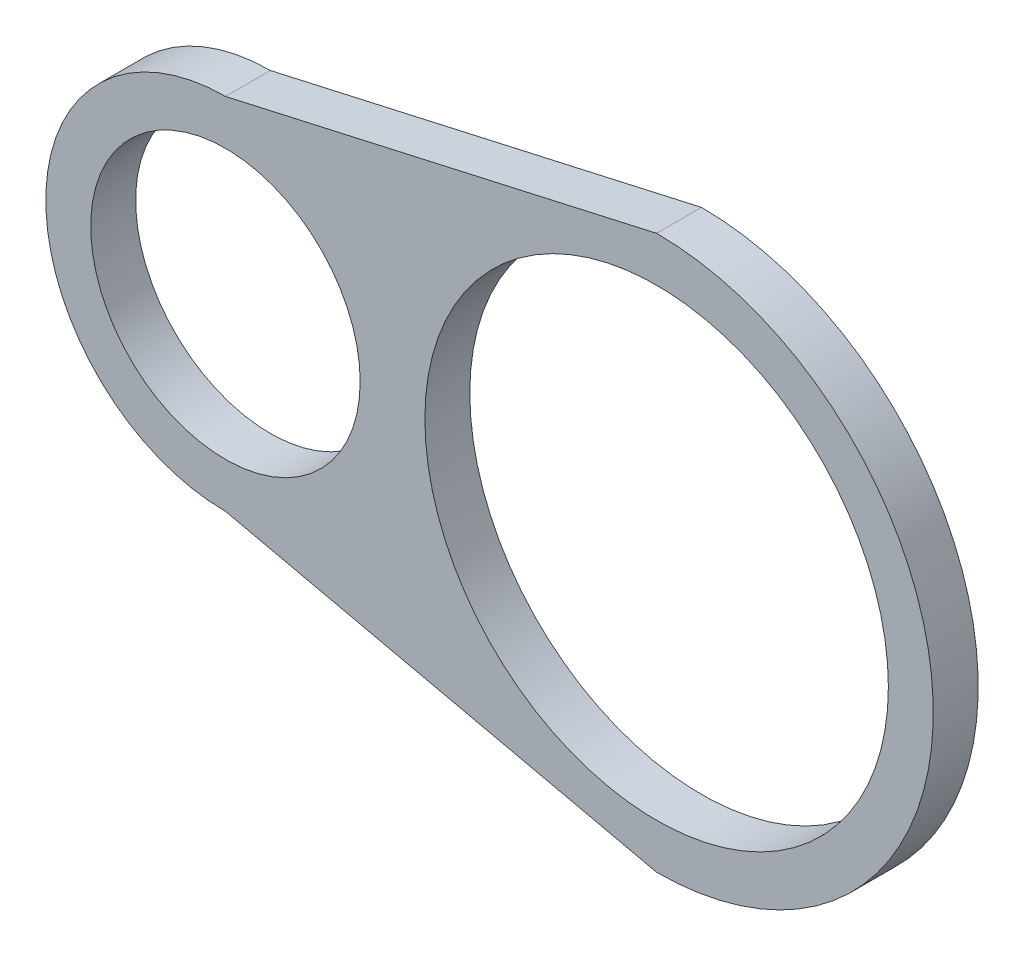
ISO-10303-21;
HEADER;
FILE_DESCRIPTION(('STEP AP214'),'2;1');
FILE_NAME('part.step','',(''),(''),'','','');
FILE_SCHEMA(('AUTOMOTIVE_DESIGN { 1 0 10303 214 1 1 1 1 }'));
ENDSEC;
DATA;
#1=APPLICATION_CONTEXT('core data for automotive mechanical design processes');
#2=APPLICATION_PROTOCOL_DEFINITION('international standard','automotive_design',2000,#1);
#3=PRODUCT_CONTEXT('',#1,'mechanical');
#4=PRODUCT('Part','Part','',(#3));
#5=PRODUCT_RELATED_PRODUCT_CATEGORY('part','',(#4));
#6=PRODUCT_DEFINITION_FORMATION('','',#4);
#7=PRODUCT_DEFINITION_CONTEXT('part definition',#1,'design');
#8=PRODUCT_DEFINITION('design','',#6,#7);
#9=PRODUCT_DEFINITION_SHAPE('','',#8);
#10=(LENGTH_UNIT() NAMED_UNIT(*) SI_UNIT(.MILLI.,.METRE.));
#11=(NAMED_UNIT(*) PLANE_ANGLE_UNIT() SI_UNIT($,.RADIAN.));
#12=(NAMED_UNIT(*) SI_UNIT($,.STERADIAN.) SOLID_ANGLE_UNIT());
#13=UNCERTAINTY_MEASURE_WITH_UNIT(LENGTH_MEASURE(1.E-05),#10,'distance_accuracy_value','');
#14=(GEOMETRIC_REPRESENTATION_CONTEXT(3) GLOBAL_UNCERTAINTY_ASSIGNED_CONTEXT((#13)) GLOBAL_UNIT_ASSIGNED_CONTEXT((#10,
#11,#12)) REPRESENTATION_CONTEXT('',''));
#15=CARTESIAN_POINT('',(0.,0.,0.));
#16=DIRECTION('',(0.,0.,1.));
#17=DIRECTION('',(1.,0.,0.));
#18=AXIS2_PLACEMENT_3D('',#15,#16,#17);
#19=CARTESIAN_POINT('',(-24.,0.,5.));
#20=DIRECTION('',(0.,0.,-1.));
#21=DIRECTION('',(-1.,0.,0.));
#22=AXIS2_PLACEMENT_3D('',#19,#20,#21);
#23=CYLINDRICAL_SURFACE('',#22,20.);
#24=CARTESIAN_POINT('',(-24.,0.,0.));
#25=DIRECTION('',(0.,0.,1.));
#26=DIRECTION('',(1.,0.,0.));
#27=AXIS2_PLACEMENT_3D('',#24,#25,#26);
#28=CIRCLE('',#27,20.);
#29=CARTESIAN_POINT('',(-24.,20.,0.));
#30=VERTEX_POINT('',#29);
#31=CARTESIAN_POINT('',(-24.,-20.,0.));
#32=VERTEX_POINT('',#31);
#33=EDGE_CURVE('E106',#30,#32,#28,.T.);
#34=ORIENTED_EDGE('',*,*,#33,.T.);
#35=DIRECTION('',(0.,0.,-1.));
#36=VECTOR('',#35,1.);
#37=CARTESIAN_POINT('',(-24.,-20.,5.));
#38=LINE('',#37,#36);
#39=CARTESIAN_POINT('',(-24.,-20.,5.));
#40=VERTEX_POINT('',#39);
#41=EDGE_CURVE('E11',#40,#32,#38,.T.);
#42=ORIENTED_EDGE('',*,*,#41,.F.);
#43=CARTESIAN_POINT('',(-24.,0.,5.));
#44=DIRECTION('',(0.,0.,1.));
#45=DIRECTION('',(1.,0.,0.));
#46=AXIS2_PLACEMENT_3D('',#43,#44,#45);
#47=CIRCLE('',#46,20.);
#48=CARTESIAN_POINT('',(-24.,20.,5.));
#49=VERTEX_POINT('',#48);
#50=EDGE_CURVE('E88',#49,#40,#47,.T.);
#51=ORIENTED_EDGE('',*,*,#50,.F.);
#52=DIRECTION('',(0.,0.,-1.));
#53=VECTOR('',#52,1.);
#54=CARTESIAN_POINT('',(-24.,20.,5.));
#55=LINE('',#54,#53);
#56=EDGE_CURVE('E105',#49,#30,#55,.T.);
#57=ORIENTED_EDGE('',*,*,#56,.T.);
#58=EDGE_LOOP('',(#34,#42,#51,#57));
#59=FACE_BOUND('',#58,.T.);
#60=ADVANCED_FACE('F36',(#59),#23,.T.);
#61=CARTESIAN_POINT('',(-5.43961927424153,-24.1760856632957,5.));
#62=DIRECTION('',(0.219512195121951,0.975609756097561,0.));
#63=DIRECTION('',(-0.975609756097561,0.219512195121951,0.));
#64=AXIS2_PLACEMENT_3D('',#61,#62,#63);
#65=PLANE('',#64);
#66=DIRECTION('',(0.975609756097561,-0.219512195121951,0.));
#67=VECTOR('',#66,1.);
#68=CARTESIAN_POINT('',(-5.43961927424153,-24.1760856632957,0.));
#69=LINE('',#68,#67);
#70=CARTESIAN_POINT('',(24.,-30.8,0.));
#71=VERTEX_POINT('',#70);
#72=EDGE_CURVE('E92',#32,#71,#69,.T.);
#73=ORIENTED_EDGE('',*,*,#72,.T.);
#74=DIRECTION('',(0.,0.,-1.));
#75=VECTOR('',#74,1.);
#76=CARTESIAN_POINT('',(24.,-30.8,5.));
#77=LINE('',#76,#75);
#78=CARTESIAN_POINT('',(24.,-30.8,5.));
#79=VERTEX_POINT('',#78);
#80=EDGE_CURVE('E44',#79,#71,#77,.T.);
#81=ORIENTED_EDGE('',*,*,#80,.F.);
#82=DIRECTION('',(0.975609756097561,-0.219512195121951,0.));
#83=VECTOR('',#82,1.);
#84=CARTESIAN_POINT('',(-5.43961927424153,-24.1760856632957,5.));
#85=LINE('',#84,#83);
#86=EDGE_CURVE('E82',#40,#79,#85,.T.);
#87=ORIENTED_EDGE('',*,*,#86,.F.);
#88=ORIENTED_EDGE('',*,*,#41,.T.);
#89=EDGE_LOOP('',(#73,#81,#87,#88));
#90=FACE_BOUND('',#89,.T.);
#91=ADVANCED_FACE('F91',(#90),#65,.F.);
#92=CARTESIAN_POINT('',(24.,0.,5.));
#93=DIRECTION('',(0.,0.,-1.));
#94=DIRECTION('',(-1.,0.,0.));
#95=AXIS2_PLACEMENT_3D('',#92,#93,#94);
#96=CYLINDRICAL_SURFACE('',#95,30.8);
#97=CARTESIAN_POINT('',(24.,0.,0.));
#98=DIRECTION('',(0.,0.,1.));
#99=DIRECTION('',(1.,0.,0.));
#100=AXIS2_PLACEMENT_3D('',#97,#98,#99);
#101=CIRCLE('',#100,30.8);
#102=CARTESIAN_POINT('',(24.,30.8,0.));
#103=VERTEX_POINT('',#102);
#104=EDGE_CURVE('E69',#71,#103,#101,.T.);
#105=ORIENTED_EDGE('',*,*,#104,.T.);
#106=DIRECTION('',(0.,0.,-1.));
#107=VECTOR('',#106,1.);
#108=CARTESIAN_POINT('',(24.,30.8,5.));
#109=LINE('',#108,#107);
#110=CARTESIAN_POINT('',(24.,30.8,5.));
#111=VERTEX_POINT('',#110);
#112=EDGE_CURVE('E93',#111,#103,#109,.T.);
#113=ORIENTED_EDGE('',*,*,#112,.F.);
#114=CARTESIAN_POINT('',(24.,0.,5.));
#115=DIRECTION('',(0.,0.,1.));
#116=DIRECTION('',(1.,0.,0.));
#117=AXIS2_PLACEMENT_3D('',#114,#115,#116);
#118=CIRCLE('',#117,30.8);
#119=EDGE_CURVE('E86',#79,#111,#118,.T.);
#120=ORIENTED_EDGE('',*,*,#119,.F.);
#121=ORIENTED_EDGE('',*,*,#80,.T.);
#122=EDGE_LOOP('',(#105,#113,#120,#121));
#123=FACE_BOUND('',#122,.T.);
#124=ADVANCED_FACE('F94',(#123),#96,.T.);
#125=CARTESIAN_POINT('',(24.,0.,5.));
#126=DIRECTION('',(0.,0.,-1.));
#127=DIRECTION('',(-1.,0.,0.));
#128=AXIS2_PLACEMENT_3D('',#125,#126,#127);
#129=CYLINDRICAL_SURFACE('',#128,25.8);
#130=CARTESIAN_POINT('',(24.,0.,5.));
#131=DIRECTION('',(0.,0.,1.));
#132=DIRECTION('',(1.,0.,0.));
#133=AXIS2_PLACEMENT_3D('',#130,#131,#132);
#134=CIRCLE('',#133,25.8);
#135=CARTESIAN_POINT('',(49.8,0.,5.));
#136=VERTEX_POINT('',#135);
#137=EDGE_CURVE('E96',#136,#136,#134,.T.);
#138=ORIENTED_EDGE('',*,*,#137,.T.);
#139=EDGE_LOOP('',(#138));
#140=FACE_BOUND('',#139,.T.);
#141=CARTESIAN_POINT('',(24.,0.,0.));
#142=DIRECTION('',(0.,0.,1.));
#143=DIRECTION('',(1.,0.,0.));
#144=AXIS2_PLACEMENT_3D('',#141,#142,#143);
#145=CIRCLE('',#144,25.8);
#146=CARTESIAN_POINT('',(49.8,0.,0.));
#147=VERTEX_POINT('',#146);
#148=EDGE_CURVE('E112',#147,#147,#145,.T.);
#149=ORIENTED_EDGE('',*,*,#148,.F.);
#150=EDGE_LOOP('',(#149));
#151=FACE_BOUND('',#150,.T.);
#152=ADVANCED_FACE('F132',(#140,#151),#129,.F.);
#153=CARTESIAN_POINT('',(-5.43961927424153,24.1760856632957,5.));
#154=DIRECTION('',(0.219512195121951,-0.975609756097561,0.));
#155=DIRECTION('',(0.975609756097561,0.219512195121951,0.));
#156=AXIS2_PLACEMENT_3D('',#153,#154,#155);
#157=PLANE('',#156);
#158=DIRECTION('',(-0.975609756097561,-0.219512195121951,0.));
#159=VECTOR('',#158,1.);
#160=CARTESIAN_POINT('',(-5.43961927424153,24.1760856632957,0.));
#161=LINE('',#160,#159);
#162=EDGE_CURVE('E75',#103,#30,#161,.T.);
#163=ORIENTED_EDGE('',*,*,#162,.T.);
#164=ORIENTED_EDGE('',*,*,#56,.F.);
#165=DIRECTION('',(-0.975609756097561,-0.219512195121951,0.));
#166=VECTOR('',#165,1.);
#167=CARTESIAN_POINT('',(-5.43961927424153,24.1760856632957,5.));
#168=LINE('',#167,#166);
#169=EDGE_CURVE('E52',#111,#49,#168,.T.);
#170=ORIENTED_EDGE('',*,*,#169,.F.);
#171=ORIENTED_EDGE('',*,*,#112,.T.);
#172=EDGE_LOOP('',(#163,#164,#170,#171));
#173=FACE_BOUND('',#172,.T.);
#174=ADVANCED_FACE('F119',(#173),#157,.F.);
#175=CARTESIAN_POINT('',(-24.,0.,5.));
#176=DIRECTION('',(0.,0.,-1.));
#177=DIRECTION('',(-1.,0.,0.));
#178=AXIS2_PLACEMENT_3D('',#175,#176,#177);
#179=CYLINDRICAL_SURFACE('',#178,15.);
#180=CARTESIAN_POINT('',(-24.,0.,5.));
#181=DIRECTION('',(0.,0.,1.));
#182=DIRECTION('',(1.,0.,0.));
#183=AXIS2_PLACEMENT_3D('',#180,#181,#182);
#184=CIRCLE('',#183,15.);
#185=CARTESIAN_POINT('',(-9.,0.,5.));
#186=VERTEX_POINT('',#185);
#187=EDGE_CURVE('E102',#186,#186,#184,.T.);
#188=ORIENTED_EDGE('',*,*,#187,.T.);
#189=EDGE_LOOP('',(#188));
#190=FACE_BOUND('',#189,.T.);
#191=CARTESIAN_POINT('',(-24.,0.,0.));
#192=DIRECTION('',(0.,0.,1.));
#193=DIRECTION('',(1.,0.,0.));
#194=AXIS2_PLACEMENT_3D('',#191,#192,#193);
#195=CIRCLE('',#194,15.);
#196=CARTESIAN_POINT('',(-9.,0.,0.));
#197=VERTEX_POINT('',#196);
#198=EDGE_CURVE('E115',#197,#197,#195,.T.);
#199=ORIENTED_EDGE('',*,*,#198,.F.);
#200=EDGE_LOOP('',(#199));
#201=FACE_BOUND('',#200,.T.);
#202=ADVANCED_FACE('F137',(#190,#201),#179,.F.);
#203=CARTESIAN_POINT('',(0.,0.,5.));
#204=DIRECTION('',(0.,0.,1.));
#205=DIRECTION('',(1.,0.,0.));
#206=AXIS2_PLACEMENT_3D('',#203,#204,#205);
#207=PLANE('',#206);
#208=ORIENTED_EDGE('',*,*,#50,.T.);
#209=ORIENTED_EDGE('',*,*,#86,.T.);
#210=ORIENTED_EDGE('',*,*,#119,.T.);
#211=ORIENTED_EDGE('',*,*,#169,.T.);
#212=EDGE_LOOP('',(#208,#209,#210,#211));
#213=FACE_BOUND('',#212,.T.);
#214=ORIENTED_EDGE('',*,*,#137,.F.);
#215=EDGE_LOOP('',(#214));
#216=FACE_BOUND('',#215,.T.);
#217=ORIENTED_EDGE('',*,*,#187,.F.);
#218=EDGE_LOOP('',(#217));
#219=FACE_BOUND('',#218,.T.);
#220=ADVANCED_FACE('F83',(#213,#216,#219),#207,.T.);
#221=CARTESIAN_POINT('',(0.,0.,0.));
#222=DIRECTION('',(0.,0.,1.));
#223=DIRECTION('',(1.,0.,0.));
#224=AXIS2_PLACEMENT_3D('',#221,#222,#223);
#225=PLANE('',#224);
#226=ORIENTED_EDGE('',*,*,#33,.F.);
#227=ORIENTED_EDGE('',*,*,#162,.F.);
#228=ORIENTED_EDGE('',*,*,#104,.F.);
#229=ORIENTED_EDGE('',*,*,#72,.F.);
#230=EDGE_LOOP('',(#226,#227,#228,#229));
#231=FACE_BOUND('',#230,.T.);
#232=ORIENTED_EDGE('',*,*,#148,.T.);
#233=EDGE_LOOP('',(#232));
#234=FACE_BOUND('',#233,.T.);
#235=ORIENTED_EDGE('',*,*,#198,.T.);
#236=EDGE_LOOP('',(#235));
#237=FACE_BOUND('',#236,.T.);
#238=ADVANCED_FACE('F122',(#231,#234,#237),#225,.F.);
#239=CLOSED_SHELL('',(#60,#91,#124,#152,#174,#202,#220,#238));
#240=MANIFOLD_SOLID_BREP('B2',#239);
#241=ADVANCED_BREP_SHAPE_REPRESENTATION('',(#18,#240),#14);
#242=SHAPE_DEFINITION_REPRESENTATION(#9,#241);
ENDSEC;
END-ISO-10303-21;
